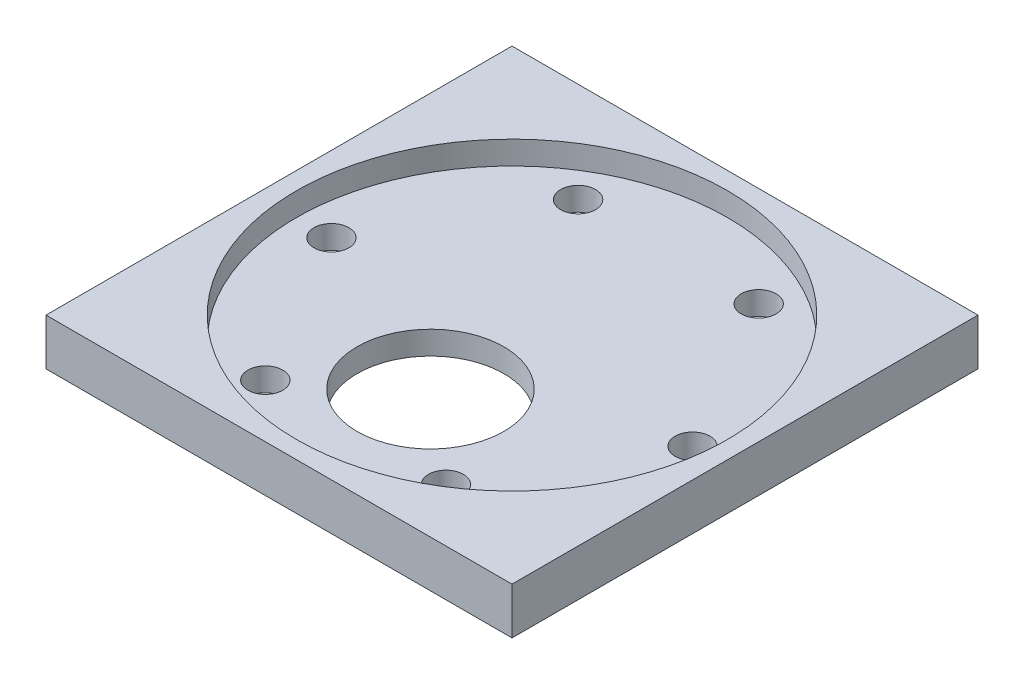
ISO-10303-21;
HEADER;
FILE_DESCRIPTION(('STEP AP214'),'2;1');
FILE_NAME('part.step','',(''),(''),'','','');
FILE_SCHEMA(('AUTOMOTIVE_DESIGN { 1 0 10303 214 1 1 1 1 }'));
ENDSEC;
DATA;
#1=APPLICATION_CONTEXT('core data for automotive mechanical design processes');
#2=APPLICATION_PROTOCOL_DEFINITION('international standard','automotive_design',2000,#1);
#3=PRODUCT_CONTEXT('',#1,'mechanical');
#4=PRODUCT('Part','Part','',(#3));
#5=PRODUCT_RELATED_PRODUCT_CATEGORY('part','',(#4));
#6=PRODUCT_DEFINITION_FORMATION('','',#4);
#7=PRODUCT_DEFINITION_CONTEXT('part definition',#1,'design');
#8=PRODUCT_DEFINITION('design','',#6,#7);
#9=PRODUCT_DEFINITION_SHAPE('','',#8);
#10=(LENGTH_UNIT() NAMED_UNIT(*) SI_UNIT(.MILLI.,.METRE.));
#11=(NAMED_UNIT(*) PLANE_ANGLE_UNIT() SI_UNIT($,.RADIAN.));
#12=(NAMED_UNIT(*) SI_UNIT($,.STERADIAN.) SOLID_ANGLE_UNIT());
#13=UNCERTAINTY_MEASURE_WITH_UNIT(LENGTH_MEASURE(1.E-05),#10,'distance_accuracy_value','');
#14=(GEOMETRIC_REPRESENTATION_CONTEXT(3) GLOBAL_UNCERTAINTY_ASSIGNED_CONTEXT((#13)) GLOBAL_UNIT_ASSIGNED_CONTEXT((#10,
#11,#12)) REPRESENTATION_CONTEXT('',''));
#15=CARTESIAN_POINT('',(0.,0.,0.));
#16=DIRECTION('',(0.,0.,1.));
#17=DIRECTION('',(1.,0.,0.));
#18=AXIS2_PLACEMENT_3D('',#15,#16,#17);
#19=CARTESIAN_POINT('',(0.,-1.,7.));
#20=DIRECTION('',(0.,1.,0.));
#21=DIRECTION('',(0.,0.,1.));
#22=AXIS2_PLACEMENT_3D('',#19,#20,#21);
#23=CYLINDRICAL_SURFACE('',#22,6.3);
#24=CARTESIAN_POINT('',(0.,0.,7.));
#25=DIRECTION('',(0.,1.,0.));
#26=DIRECTION('',(0.,0.,1.));
#27=AXIS2_PLACEMENT_3D('',#24,#25,#26);
#28=CIRCLE('',#27,6.3);
#29=CARTESIAN_POINT('',(0.,0.,13.3));
#30=VERTEX_POINT('',#29);
#31=EDGE_CURVE('E109',#30,#30,#28,.T.);
#32=ORIENTED_EDGE('',*,*,#31,.F.);
#33=EDGE_LOOP('',(#32));
#34=FACE_BOUND('',#33,.T.);
#35=CARTESIAN_POINT('',(0.,2.,7.));
#36=DIRECTION('',(0.,1.,0.));
#37=DIRECTION('',(0.,0.,1.));
#38=AXIS2_PLACEMENT_3D('',#35,#36,#37);
#39=CIRCLE('',#38,6.3);
#40=CARTESIAN_POINT('',(0.,2.,13.3));
#41=VERTEX_POINT('',#40);
#42=EDGE_CURVE('E113',#41,#41,#39,.F.);
#43=ORIENTED_EDGE('',*,*,#42,.F.);
#44=EDGE_LOOP('',(#43));
#45=FACE_BOUND('',#44,.T.);
#46=ADVANCED_FACE('F33',(#34,#45),#23,.F.);
#47=CARTESIAN_POINT('',(15.5,-1.,0.));
#48=DIRECTION('',(0.,1.,0.));
#49=DIRECTION('',(0.,0.,1.));
#50=AXIS2_PLACEMENT_3D('',#47,#48,#49);
#51=CYLINDRICAL_SURFACE('',#50,1.5);
#52=CARTESIAN_POINT('',(15.5,0.,0.));
#53=DIRECTION('',(0.,1.,0.));
#54=DIRECTION('',(0.,0.,1.));
#55=AXIS2_PLACEMENT_3D('',#52,#53,#54);
#56=CIRCLE('',#55,1.5);
#57=CARTESIAN_POINT('',(15.5,0.,1.5));
#58=VERTEX_POINT('',#57);
#59=EDGE_CURVE('E112',#58,#58,#56,.T.);
#60=ORIENTED_EDGE('',*,*,#59,.F.);
#61=EDGE_LOOP('',(#60));
#62=FACE_BOUND('',#61,.T.);
#63=CARTESIAN_POINT('',(15.5,2.,0.));
#64=DIRECTION('',(0.,1.,0.));
#65=DIRECTION('',(0.,0.,1.));
#66=AXIS2_PLACEMENT_3D('',#63,#64,#65);
#67=CIRCLE('',#66,1.5);
#68=CARTESIAN_POINT('',(15.5,2.,1.5));
#69=VERTEX_POINT('',#68);
#70=EDGE_CURVE('E162',#69,#69,#67,.F.);
#71=ORIENTED_EDGE('',*,*,#70,.F.);
#72=EDGE_LOOP('',(#71));
#73=FACE_BOUND('',#72,.T.);
#74=ADVANCED_FACE('F171',(#62,#73),#51,.F.);
#75=CARTESIAN_POINT('',(7.75,-1.,13.4233937586588));
#76=DIRECTION('',(0.,1.,0.));
#77=DIRECTION('',(0.,0.,1.));
#78=AXIS2_PLACEMENT_3D('',#75,#76,#77);
#79=CYLINDRICAL_SURFACE('',#78,1.5);
#80=CARTESIAN_POINT('',(7.75,0.,13.4233937586588));
#81=DIRECTION('',(0.,1.,0.));
#82=DIRECTION('',(0.,0.,1.));
#83=AXIS2_PLACEMENT_3D('',#80,#81,#82);
#84=CIRCLE('',#83,1.5);
#85=CARTESIAN_POINT('',(7.75,0.,14.9233937586588));
#86=VERTEX_POINT('',#85);
#87=EDGE_CURVE('E116',#86,#86,#84,.T.);
#88=ORIENTED_EDGE('',*,*,#87,.F.);
#89=EDGE_LOOP('',(#88));
#90=FACE_BOUND('',#89,.T.);
#91=CARTESIAN_POINT('',(7.75,2.,13.4233937586588));
#92=DIRECTION('',(0.,1.,0.));
#93=DIRECTION('',(0.,0.,1.));
#94=AXIS2_PLACEMENT_3D('',#91,#92,#93);
#95=CIRCLE('',#94,1.5);
#96=CARTESIAN_POINT('',(7.75,2.,14.9233937586588));
#97=VERTEX_POINT('',#96);
#98=EDGE_CURVE('E159',#97,#97,#95,.F.);
#99=ORIENTED_EDGE('',*,*,#98,.F.);
#100=EDGE_LOOP('',(#99));
#101=FACE_BOUND('',#100,.T.);
#102=ADVANCED_FACE('F177',(#90,#101),#79,.F.);
#103=CARTESIAN_POINT('',(-7.74999999999999,-1.,13.4233937586588));
#104=DIRECTION('',(0.,1.,0.));
#105=DIRECTION('',(0.,0.,1.));
#106=AXIS2_PLACEMENT_3D('',#103,#104,#105);
#107=CYLINDRICAL_SURFACE('',#106,1.5);
#108=CARTESIAN_POINT('',(-7.74999999999999,0.,13.4233937586588));
#109=DIRECTION('',(0.,1.,0.));
#110=DIRECTION('',(0.,0.,1.));
#111=AXIS2_PLACEMENT_3D('',#108,#109,#110);
#112=CIRCLE('',#111,1.5);
#113=CARTESIAN_POINT('',(-7.74999999999999,0.,14.9233937586588));
#114=VERTEX_POINT('',#113);
#115=EDGE_CURVE('E119',#114,#114,#112,.T.);
#116=ORIENTED_EDGE('',*,*,#115,.F.);
#117=EDGE_LOOP('',(#116));
#118=FACE_BOUND('',#117,.T.);
#119=CARTESIAN_POINT('',(-7.74999999999999,2.,13.4233937586588));
#120=DIRECTION('',(0.,1.,0.));
#121=DIRECTION('',(0.,0.,1.));
#122=AXIS2_PLACEMENT_3D('',#119,#120,#121);
#123=CIRCLE('',#122,1.5);
#124=CARTESIAN_POINT('',(-7.74999999999999,2.,14.9233937586588));
#125=VERTEX_POINT('',#124);
#126=EDGE_CURVE('E156',#125,#125,#123,.F.);
#127=ORIENTED_EDGE('',*,*,#126,.F.);
#128=EDGE_LOOP('',(#127));
#129=FACE_BOUND('',#128,.T.);
#130=ADVANCED_FACE('F219',(#118,#129),#107,.F.);
#131=CARTESIAN_POINT('',(-15.5,-1.,0.));
#132=DIRECTION('',(0.,1.,0.));
#133=DIRECTION('',(0.,0.,1.));
#134=AXIS2_PLACEMENT_3D('',#131,#132,#133);
#135=CYLINDRICAL_SURFACE('',#134,1.5);
#136=CARTESIAN_POINT('',(-15.5,0.,0.));
#137=DIRECTION('',(0.,1.,0.));
#138=DIRECTION('',(0.,0.,1.));
#139=AXIS2_PLACEMENT_3D('',#136,#137,#138);
#140=CIRCLE('',#139,1.5);
#141=CARTESIAN_POINT('',(-15.5,0.,1.5));
#142=VERTEX_POINT('',#141);
#143=EDGE_CURVE('E122',#142,#142,#140,.T.);
#144=ORIENTED_EDGE('',*,*,#143,.F.);
#145=EDGE_LOOP('',(#144));
#146=FACE_BOUND('',#145,.T.);
#147=CARTESIAN_POINT('',(-15.5,2.,0.));
#148=DIRECTION('',(0.,1.,0.));
#149=DIRECTION('',(0.,0.,1.));
#150=AXIS2_PLACEMENT_3D('',#147,#148,#149);
#151=CIRCLE('',#150,1.5);
#152=CARTESIAN_POINT('',(-15.5,2.,1.5));
#153=VERTEX_POINT('',#152);
#154=EDGE_CURVE('E144',#153,#153,#151,.F.);
#155=ORIENTED_EDGE('',*,*,#154,.F.);
#156=EDGE_LOOP('',(#155));
#157=FACE_BOUND('',#156,.T.);
#158=ADVANCED_FACE('F212',(#146,#157),#135,.F.);
#159=CARTESIAN_POINT('',(-7.75,-1.,-13.4233937586588));
#160=DIRECTION('',(0.,1.,0.));
#161=DIRECTION('',(0.,0.,1.));
#162=AXIS2_PLACEMENT_3D('',#159,#160,#161);
#163=CYLINDRICAL_SURFACE('',#162,1.5);
#164=CARTESIAN_POINT('',(-7.75,0.,-13.4233937586588));
#165=DIRECTION('',(0.,1.,0.));
#166=DIRECTION('',(0.,0.,1.));
#167=AXIS2_PLACEMENT_3D('',#164,#165,#166);
#168=CIRCLE('',#167,1.5);
#169=CARTESIAN_POINT('',(-7.75,0.,-11.9233937586588));
#170=VERTEX_POINT('',#169);
#171=EDGE_CURVE('E125',#170,#170,#168,.T.);
#172=ORIENTED_EDGE('',*,*,#171,.F.);
#173=EDGE_LOOP('',(#172));
#174=FACE_BOUND('',#173,.T.);
#175=CARTESIAN_POINT('',(-7.75,2.,-13.4233937586588));
#176=DIRECTION('',(0.,1.,0.));
#177=DIRECTION('',(0.,0.,1.));
#178=AXIS2_PLACEMENT_3D('',#175,#176,#177);
#179=CIRCLE('',#178,1.5);
#180=CARTESIAN_POINT('',(-7.75,2.,-11.9233937586588));
#181=VERTEX_POINT('',#180);
#182=EDGE_CURVE('E141',#181,#181,#179,.F.);
#183=ORIENTED_EDGE('',*,*,#182,.F.);
#184=EDGE_LOOP('',(#183));
#185=FACE_BOUND('',#184,.T.);
#186=ADVANCED_FACE('F136',(#174,#185),#163,.F.);
#187=CARTESIAN_POINT('',(7.75,-1.,-13.4233937586588));
#188=DIRECTION('',(0.,1.,0.));
#189=DIRECTION('',(0.,0.,1.));
#190=AXIS2_PLACEMENT_3D('',#187,#188,#189);
#191=CYLINDRICAL_SURFACE('',#190,1.5);
#192=CARTESIAN_POINT('',(7.75,0.,-13.4233937586588));
#193=DIRECTION('',(0.,1.,0.));
#194=DIRECTION('',(0.,0.,1.));
#195=AXIS2_PLACEMENT_3D('',#192,#193,#194);
#196=CIRCLE('',#195,1.5);
#197=CARTESIAN_POINT('',(7.75,0.,-11.9233937586588));
#198=VERTEX_POINT('',#197);
#199=EDGE_CURVE('E103',#198,#198,#196,.T.);
#200=ORIENTED_EDGE('',*,*,#199,.F.);
#201=EDGE_LOOP('',(#200));
#202=FACE_BOUND('',#201,.T.);
#203=CARTESIAN_POINT('',(7.75,2.,-13.4233937586588));
#204=DIRECTION('',(0.,1.,0.));
#205=DIRECTION('',(0.,0.,1.));
#206=AXIS2_PLACEMENT_3D('',#203,#204,#205);
#207=CIRCLE('',#206,1.5);
#208=CARTESIAN_POINT('',(7.75,2.,-11.9233937586588));
#209=VERTEX_POINT('',#208);
#210=EDGE_CURVE('E37',#209,#209,#207,.F.);
#211=ORIENTED_EDGE('',*,*,#210,.F.);
#212=EDGE_LOOP('',(#211));
#213=FACE_BOUND('',#212,.T.);
#214=ADVANCED_FACE('F133',(#202,#213),#191,.F.);
#215=CARTESIAN_POINT('',(-20.,4.,-20.));
#216=DIRECTION('',(1.,0.,0.));
#217=DIRECTION('',(0.,0.,-1.));
#218=AXIS2_PLACEMENT_3D('',#215,#216,#217);
#219=PLANE('',#218);
#220=DIRECTION('',(0.,0.,1.));
#221=VECTOR('',#220,1.);
#222=CARTESIAN_POINT('',(-20.,0.,-20.));
#223=LINE('',#222,#221);
#224=CARTESIAN_POINT('',(-20.,0.,-20.));
#225=VERTEX_POINT('',#224);
#226=CARTESIAN_POINT('',(-20.,0.,20.));
#227=VERTEX_POINT('',#226);
#228=EDGE_CURVE('E100',#225,#227,#223,.T.);
#229=ORIENTED_EDGE('',*,*,#228,.T.);
#230=DIRECTION('',(0.,-1.,0.));
#231=VECTOR('',#230,1.);
#232=CARTESIAN_POINT('',(-20.,4.,20.));
#233=LINE('',#232,#231);
#234=CARTESIAN_POINT('',(-20.,4.,20.));
#235=VERTEX_POINT('',#234);
#236=EDGE_CURVE('E11',#235,#227,#233,.T.);
#237=ORIENTED_EDGE('',*,*,#236,.F.);
#238=DIRECTION('',(0.,0.,1.));
#239=VECTOR('',#238,1.);
#240=CARTESIAN_POINT('',(-20.,4.,-20.));
#241=LINE('',#240,#239);
#242=CARTESIAN_POINT('',(-20.,4.,-20.));
#243=VERTEX_POINT('',#242);
#244=EDGE_CURVE('E87',#243,#235,#241,.T.);
#245=ORIENTED_EDGE('',*,*,#244,.F.);
#246=DIRECTION('',(0.,-1.,0.));
#247=VECTOR('',#246,1.);
#248=CARTESIAN_POINT('',(-20.,4.,-20.));
#249=LINE('',#248,#247);
#250=EDGE_CURVE('E96',#243,#225,#249,.T.);
#251=ORIENTED_EDGE('',*,*,#250,.T.);
#252=EDGE_LOOP('',(#229,#237,#245,#251));
#253=FACE_BOUND('',#252,.T.);
#254=ADVANCED_FACE('F35',(#253),#219,.F.);
#255=CARTESIAN_POINT('',(-20.,4.,20.));
#256=DIRECTION('',(0.,0.,-1.));
#257=DIRECTION('',(-1.,0.,0.));
#258=AXIS2_PLACEMENT_3D('',#255,#256,#257);
#259=PLANE('',#258);
#260=DIRECTION('',(1.,0.,0.));
#261=VECTOR('',#260,1.);
#262=CARTESIAN_POINT('',(-20.,0.,20.));
#263=LINE('',#262,#261);
#264=CARTESIAN_POINT('',(20.,0.,20.));
#265=VERTEX_POINT('',#264);
#266=EDGE_CURVE('E91',#227,#265,#263,.T.);
#267=ORIENTED_EDGE('',*,*,#266,.T.);
#268=DIRECTION('',(0.,-1.,0.));
#269=VECTOR('',#268,1.);
#270=CARTESIAN_POINT('',(20.,4.,20.));
#271=LINE('',#270,#269);
#272=CARTESIAN_POINT('',(20.,4.,20.));
#273=VERTEX_POINT('',#272);
#274=EDGE_CURVE('E43',#273,#265,#271,.T.);
#275=ORIENTED_EDGE('',*,*,#274,.F.);
#276=DIRECTION('',(1.,0.,0.));
#277=VECTOR('',#276,1.);
#278=CARTESIAN_POINT('',(-20.,4.,20.));
#279=LINE('',#278,#277);
#280=EDGE_CURVE('E82',#235,#273,#279,.T.);
#281=ORIENTED_EDGE('',*,*,#280,.F.);
#282=ORIENTED_EDGE('',*,*,#236,.T.);
#283=EDGE_LOOP('',(#267,#275,#281,#282));
#284=FACE_BOUND('',#283,.T.);
#285=ADVANCED_FACE('F90',(#284),#259,.F.);
#286=CARTESIAN_POINT('',(20.,4.,-20.));
#287=DIRECTION('',(-1.,0.,0.));
#288=DIRECTION('',(0.,0.,1.));
#289=AXIS2_PLACEMENT_3D('',#286,#287,#288);
#290=PLANE('',#289);
#291=DIRECTION('',(0.,0.,-1.));
#292=VECTOR('',#291,1.);
#293=CARTESIAN_POINT('',(20.,0.,-20.));
#294=LINE('',#293,#292);
#295=CARTESIAN_POINT('',(20.,0.,-20.));
#296=VERTEX_POINT('',#295);
#297=EDGE_CURVE('E69',#265,#296,#294,.T.);
#298=ORIENTED_EDGE('',*,*,#297,.T.);
#299=DIRECTION('',(0.,-1.,0.));
#300=VECTOR('',#299,1.);
#301=CARTESIAN_POINT('',(20.,4.,-20.));
#302=LINE('',#301,#300);
#303=CARTESIAN_POINT('',(20.,4.,-20.));
#304=VERTEX_POINT('',#303);
#305=EDGE_CURVE('E92',#304,#296,#302,.T.);
#306=ORIENTED_EDGE('',*,*,#305,.F.);
#307=DIRECTION('',(0.,0.,-1.));
#308=VECTOR('',#307,1.);
#309=CARTESIAN_POINT('',(20.,4.,-20.));
#310=LINE('',#309,#308);
#311=EDGE_CURVE('E85',#273,#304,#310,.T.);
#312=ORIENTED_EDGE('',*,*,#311,.F.);
#313=ORIENTED_EDGE('',*,*,#274,.T.);
#314=EDGE_LOOP('',(#298,#306,#312,#313));
#315=FACE_BOUND('',#314,.T.);
#316=ADVANCED_FACE('F94',(#315),#290,.F.);
#317=CARTESIAN_POINT('',(-20.,4.,-20.));
#318=DIRECTION('',(0.,0.,1.));
#319=DIRECTION('',(1.,0.,0.));
#320=AXIS2_PLACEMENT_3D('',#317,#318,#319);
#321=PLANE('',#320);
#322=DIRECTION('',(-1.,0.,0.));
#323=VECTOR('',#322,1.);
#324=CARTESIAN_POINT('',(-20.,0.,-20.));
#325=LINE('',#324,#323);
#326=EDGE_CURVE('E75',#296,#225,#325,.T.);
#327=ORIENTED_EDGE('',*,*,#326,.T.);
#328=ORIENTED_EDGE('',*,*,#250,.F.);
#329=DIRECTION('',(-1.,0.,0.));
#330=VECTOR('',#329,1.);
#331=CARTESIAN_POINT('',(-20.,4.,-20.));
#332=LINE('',#331,#330);
#333=EDGE_CURVE('E52',#304,#243,#332,.T.);
#334=ORIENTED_EDGE('',*,*,#333,.F.);
#335=ORIENTED_EDGE('',*,*,#305,.T.);
#336=EDGE_LOOP('',(#327,#328,#334,#335));
#337=FACE_BOUND('',#336,.T.);
#338=ADVANCED_FACE('F185',(#337),#321,.F.);
#339=CARTESIAN_POINT('',(0.,4.,0.));
#340=DIRECTION('',(0.,1.,0.));
#341=DIRECTION('',(0.,0.,1.));
#342=AXIS2_PLACEMENT_3D('',#339,#340,#341);
#343=PLANE('',#342);
#344=CARTESIAN_POINT('',(0.,4.,0.));
#345=DIRECTION('',(0.,1.,0.));
#346=DIRECTION('',(0.,0.,1.));
#347=AXIS2_PLACEMENT_3D('',#344,#345,#346);
#348=CIRCLE('',#347,18.5);
#349=CARTESIAN_POINT('',(0.,4.,18.5));
#350=VERTEX_POINT('',#349);
#351=EDGE_CURVE('E147',#350,#350,#348,.T.);
#352=ORIENTED_EDGE('',*,*,#351,.F.);
#353=EDGE_LOOP('',(#352));
#354=FACE_BOUND('',#353,.T.);
#355=ORIENTED_EDGE('',*,*,#244,.T.);
#356=ORIENTED_EDGE('',*,*,#280,.T.);
#357=ORIENTED_EDGE('',*,*,#311,.T.);
#358=ORIENTED_EDGE('',*,*,#333,.T.);
#359=EDGE_LOOP('',(#355,#356,#357,#358));
#360=FACE_BOUND('',#359,.T.);
#361=ADVANCED_FACE('F83',(#354,#360),#343,.T.);
#362=CARTESIAN_POINT('',(0.,0.,0.));
#363=DIRECTION('',(0.,1.,0.));
#364=DIRECTION('',(0.,0.,1.));
#365=AXIS2_PLACEMENT_3D('',#362,#363,#364);
#366=PLANE('',#365);
#367=ORIENTED_EDGE('',*,*,#199,.T.);
#368=EDGE_LOOP('',(#367));
#369=FACE_BOUND('',#368,.T.);
#370=ORIENTED_EDGE('',*,*,#171,.T.);
#371=EDGE_LOOP('',(#370));
#372=FACE_BOUND('',#371,.T.);
#373=ORIENTED_EDGE('',*,*,#143,.T.);
#374=EDGE_LOOP('',(#373));
#375=FACE_BOUND('',#374,.T.);
#376=ORIENTED_EDGE('',*,*,#115,.T.);
#377=EDGE_LOOP('',(#376));
#378=FACE_BOUND('',#377,.T.);
#379=ORIENTED_EDGE('',*,*,#87,.T.);
#380=EDGE_LOOP('',(#379));
#381=FACE_BOUND('',#380,.T.);
#382=ORIENTED_EDGE('',*,*,#59,.T.);
#383=EDGE_LOOP('',(#382));
#384=FACE_BOUND('',#383,.T.);
#385=ORIENTED_EDGE('',*,*,#31,.T.);
#386=EDGE_LOOP('',(#385));
#387=FACE_BOUND('',#386,.T.);
#388=ORIENTED_EDGE('',*,*,#228,.F.);
#389=ORIENTED_EDGE('',*,*,#326,.F.);
#390=ORIENTED_EDGE('',*,*,#297,.F.);
#391=ORIENTED_EDGE('',*,*,#266,.F.);
#392=EDGE_LOOP('',(#388,#389,#390,#391));
#393=FACE_BOUND('',#392,.T.);
#394=ADVANCED_FACE('F130',(#369,#372,#375,#378,#381,#384,#387,#393),#366,.F.);
#395=CARTESIAN_POINT('',(0.,2.,0.));
#396=DIRECTION('',(0.,1.,0.));
#397=DIRECTION('',(0.,0.,1.));
#398=AXIS2_PLACEMENT_3D('',#395,#396,#397);
#399=PLANE('',#398);
#400=CARTESIAN_POINT('',(0.,2.,0.));
#401=DIRECTION('',(0.,1.,0.));
#402=DIRECTION('',(0.,0.,1.));
#403=AXIS2_PLACEMENT_3D('',#400,#401,#402);
#404=CIRCLE('',#403,18.5);
#405=CARTESIAN_POINT('',(0.,2.,18.5));
#406=VERTEX_POINT('',#405);
#407=EDGE_CURVE('E142',#406,#406,#404,.T.);
#408=ORIENTED_EDGE('',*,*,#407,.T.);
#409=EDGE_LOOP('',(#408));
#410=FACE_BOUND('',#409,.T.);
#411=ORIENTED_EDGE('',*,*,#210,.T.);
#412=EDGE_LOOP('',(#411));
#413=FACE_BOUND('',#412,.T.);
#414=ORIENTED_EDGE('',*,*,#182,.T.);
#415=EDGE_LOOP('',(#414));
#416=FACE_BOUND('',#415,.T.);
#417=ORIENTED_EDGE('',*,*,#154,.T.);
#418=EDGE_LOOP('',(#417));
#419=FACE_BOUND('',#418,.T.);
#420=ORIENTED_EDGE('',*,*,#126,.T.);
#421=EDGE_LOOP('',(#420));
#422=FACE_BOUND('',#421,.T.);
#423=ORIENTED_EDGE('',*,*,#98,.T.);
#424=EDGE_LOOP('',(#423));
#425=FACE_BOUND('',#424,.T.);
#426=ORIENTED_EDGE('',*,*,#70,.T.);
#427=EDGE_LOOP('',(#426));
#428=FACE_BOUND('',#427,.T.);
#429=ORIENTED_EDGE('',*,*,#42,.T.);
#430=EDGE_LOOP('',(#429));
#431=FACE_BOUND('',#430,.T.);
#432=ADVANCED_FACE('F168',(#410,#413,#416,#419,#422,#425,#428,#431),#399,.T.);
#433=CARTESIAN_POINT('',(0.,2.,0.));
#434=DIRECTION('',(0.,1.,0.));
#435=DIRECTION('',(0.,0.,1.));
#436=AXIS2_PLACEMENT_3D('',#433,#434,#435);
#437=CYLINDRICAL_SURFACE('',#436,18.5);
#438=ORIENTED_EDGE('',*,*,#407,.F.);
#439=EDGE_LOOP('',(#438));
#440=FACE_BOUND('',#439,.T.);
#441=ORIENTED_EDGE('',*,*,#351,.T.);
#442=EDGE_LOOP('',(#441));
#443=FACE_BOUND('',#442,.T.);
#444=ADVANCED_FACE('F281',(#440,#443),#437,.F.);
#445=CLOSED_SHELL('',(#46,#74,#102,#130,#158,#186,#214,#254,#285,#316,#338,#361,#394,#432,#444));
#446=MANIFOLD_SOLID_BREP('B2',#445);
#447=ADVANCED_BREP_SHAPE_REPRESENTATION('',(#18,#446),#14);
#448=SHAPE_DEFINITION_REPRESENTATION(#9,#447);
ENDSEC;
END-ISO-10303-21;
